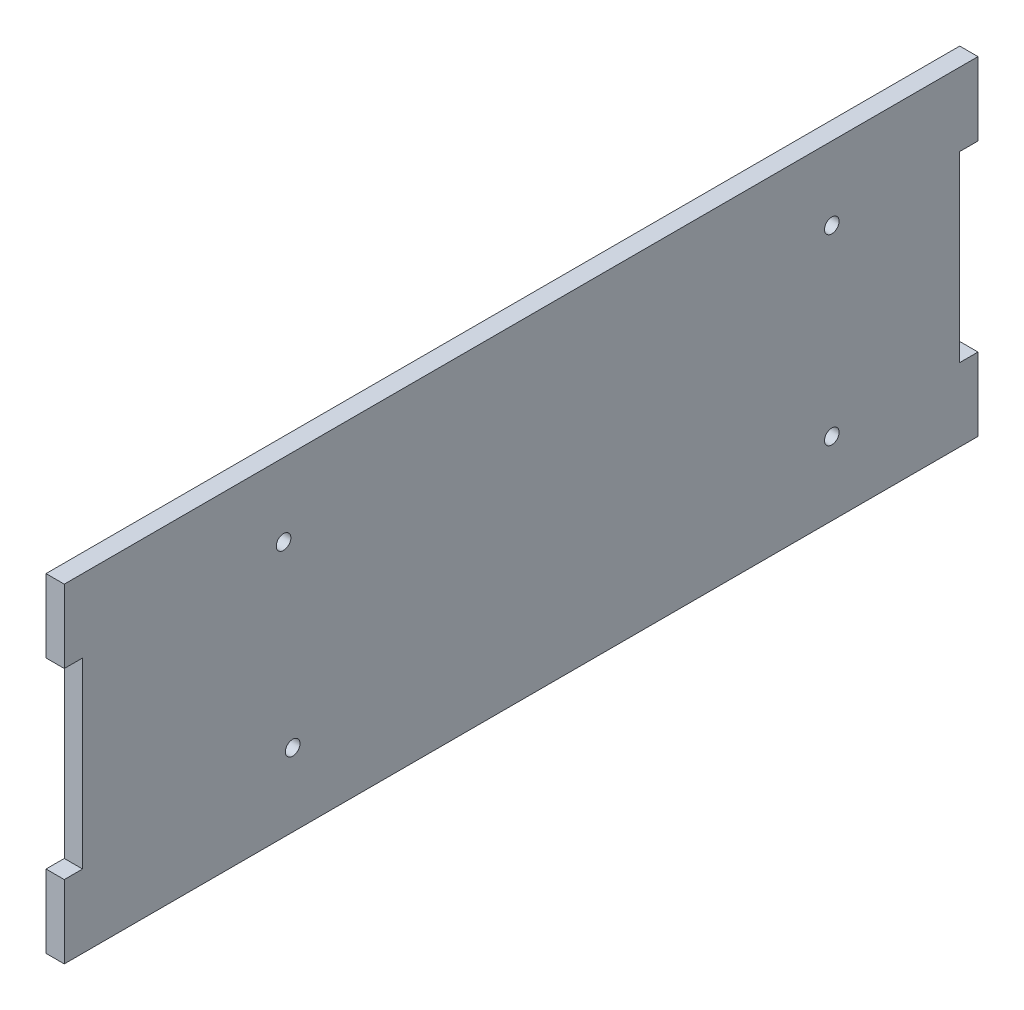
ISO-10303-21;
HEADER;
FILE_DESCRIPTION(('STEP AP214'),'2;1');
FILE_NAME('part.step','',(''),(''),'','','');
FILE_SCHEMA(('AUTOMOTIVE_DESIGN { 1 0 10303 214 1 1 1 1 }'));
ENDSEC;
DATA;
#1=APPLICATION_CONTEXT('core data for automotive mechanical design processes');
#2=APPLICATION_PROTOCOL_DEFINITION('international standard','automotive_design',2000,#1);
#3=PRODUCT_CONTEXT('',#1,'mechanical');
#4=PRODUCT('Part','Part','',(#3));
#5=PRODUCT_RELATED_PRODUCT_CATEGORY('part','',(#4));
#6=PRODUCT_DEFINITION_FORMATION('','',#4);
#7=PRODUCT_DEFINITION_CONTEXT('part definition',#1,'design');
#8=PRODUCT_DEFINITION('design','',#6,#7);
#9=PRODUCT_DEFINITION_SHAPE('','',#8);
#10=(LENGTH_UNIT() NAMED_UNIT(*) SI_UNIT(.MILLI.,.METRE.));
#11=(NAMED_UNIT(*) PLANE_ANGLE_UNIT() SI_UNIT($,.RADIAN.));
#12=(NAMED_UNIT(*) SI_UNIT($,.STERADIAN.) SOLID_ANGLE_UNIT());
#13=UNCERTAINTY_MEASURE_WITH_UNIT(LENGTH_MEASURE(1.E-05),#10,'distance_accuracy_value','');
#14=(GEOMETRIC_REPRESENTATION_CONTEXT(3) GLOBAL_UNCERTAINTY_ASSIGNED_CONTEXT((#13)) GLOBAL_UNIT_ASSIGNED_CONTEXT((#10,
#11,#12)) REPRESENTATION_CONTEXT('',''));
#15=CARTESIAN_POINT('',(0.,0.,0.));
#16=DIRECTION('',(0.,0.,1.));
#17=DIRECTION('',(1.,0.,0.));
#18=AXIS2_PLACEMENT_3D('',#15,#16,#17);
#19=CARTESIAN_POINT('',(5.,0.,0.));
#20=DIRECTION('',(1.,0.,0.));
#21=DIRECTION('',(0.,0.,-1.));
#22=AXIS2_PLACEMENT_3D('',#19,#20,#21);
#23=PLANE('',#22);
#24=CARTESIAN_POINT('',(5.,20.,187.5));
#25=DIRECTION('',(1.,0.,0.));
#26=DIRECTION('',(0.,0.,-1.));
#27=AXIS2_PLACEMENT_3D('',#24,#25,#26);
#28=CIRCLE('',#27,2.00000000000002);
#29=CARTESIAN_POINT('',(5.,20.,185.5));
#30=VERTEX_POINT('',#29);
#31=EDGE_CURVE('E293',#30,#30,#28,.T.);
#32=ORIENTED_EDGE('',*,*,#31,.F.);
#33=EDGE_LOOP('',(#32));
#34=FACE_BOUND('',#33,.T.);
#35=CARTESIAN_POINT('',(5.,70.,40.));
#36=DIRECTION('',(1.,0.,0.));
#37=DIRECTION('',(0.,0.,-1.));
#38=AXIS2_PLACEMENT_3D('',#35,#36,#37);
#39=CIRCLE('',#38,2.);
#40=CARTESIAN_POINT('',(5.,70.,38.));
#41=VERTEX_POINT('',#40);
#42=EDGE_CURVE('E160',#41,#41,#39,.T.);
#43=ORIENTED_EDGE('',*,*,#42,.F.);
#44=EDGE_LOOP('',(#43));
#45=FACE_BOUND('',#44,.T.);
#46=DIRECTION('',(0.,1.,0.));
#47=VECTOR('',#46,1.);
#48=CARTESIAN_POINT('',(5.,0.,0.));
#49=LINE('',#48,#47);
#50=CARTESIAN_POINT('',(5.,0.,0.));
#51=VERTEX_POINT('',#50);
#52=CARTESIAN_POINT('',(5.,20.,0.));
#53=VERTEX_POINT('',#52);
#54=EDGE_CURVE('E179',#51,#53,#49,.T.);
#55=ORIENTED_EDGE('',*,*,#54,.T.);
#56=DIRECTION('',(0.,0.,1.));
#57=VECTOR('',#56,1.);
#58=CARTESIAN_POINT('',(5.,20.,0.));
#59=LINE('',#58,#57);
#60=CARTESIAN_POINT('',(5.,20.,5.));
#61=VERTEX_POINT('',#60);
#62=EDGE_CURVE('E107',#53,#61,#59,.T.);
#63=ORIENTED_EDGE('',*,*,#62,.T.);
#64=DIRECTION('',(0.,1.,0.));
#65=VECTOR('',#64,1.);
#66=CARTESIAN_POINT('',(5.,70.,5.00000000000006));
#67=LINE('',#66,#65);
#68=CARTESIAN_POINT('',(5.,70.,5.00000000000006));
#69=VERTEX_POINT('',#68);
#70=EDGE_CURVE('E206',#61,#69,#67,.T.);
#71=ORIENTED_EDGE('',*,*,#70,.T.);
#72=DIRECTION('',(0.,0.,-1.));
#73=VECTOR('',#72,1.);
#74=CARTESIAN_POINT('',(5.,70.,0.));
#75=LINE('',#74,#73);
#76=CARTESIAN_POINT('',(5.,70.,0.));
#77=VERTEX_POINT('',#76);
#78=EDGE_CURVE('E225',#69,#77,#75,.T.);
#79=ORIENTED_EDGE('',*,*,#78,.T.);
#80=DIRECTION('',(0.,1.,0.));
#81=VECTOR('',#80,1.);
#82=CARTESIAN_POINT('',(5.,70.,0.));
#83=LINE('',#82,#81);
#84=CARTESIAN_POINT('',(5.,90.,0.));
#85=VERTEX_POINT('',#84);
#86=EDGE_CURVE('E222',#77,#85,#83,.T.);
#87=ORIENTED_EDGE('',*,*,#86,.T.);
#88=DIRECTION('',(0.,0.,1.));
#89=VECTOR('',#88,1.);
#90=CARTESIAN_POINT('',(5.,90.,0.));
#91=LINE('',#90,#89);
#92=CARTESIAN_POINT('',(5.,90.,250.));
#93=VERTEX_POINT('',#92);
#94=EDGE_CURVE('E224',#85,#93,#91,.T.);
#95=ORIENTED_EDGE('',*,*,#94,.T.);
#96=DIRECTION('',(0.,-1.,0.));
#97=VECTOR('',#96,1.);
#98=CARTESIAN_POINT('',(5.,70.,250.));
#99=LINE('',#98,#97);
#100=CARTESIAN_POINT('',(5.,70.,250.));
#101=VERTEX_POINT('',#100);
#102=EDGE_CURVE('E227',#93,#101,#99,.T.);
#103=ORIENTED_EDGE('',*,*,#102,.T.);
#104=DIRECTION('',(0.,0.,-1.));
#105=VECTOR('',#104,1.);
#106=CARTESIAN_POINT('',(5.,70.,250.));
#107=LINE('',#106,#105);
#108=CARTESIAN_POINT('',(5.,70.,245.));
#109=VERTEX_POINT('',#108);
#110=EDGE_CURVE('E233',#101,#109,#107,.T.);
#111=ORIENTED_EDGE('',*,*,#110,.T.);
#112=DIRECTION('',(0.,-1.,0.));
#113=VECTOR('',#112,1.);
#114=CARTESIAN_POINT('',(5.,70.,245.));
#115=LINE('',#114,#113);
#116=CARTESIAN_POINT('',(5.,20.,245.));
#117=VERTEX_POINT('',#116);
#118=EDGE_CURVE('E138',#109,#117,#115,.T.);
#119=ORIENTED_EDGE('',*,*,#118,.T.);
#120=DIRECTION('',(0.,0.,1.));
#121=VECTOR('',#120,1.);
#122=CARTESIAN_POINT('',(5.,20.,250.));
#123=LINE('',#122,#121);
#124=CARTESIAN_POINT('',(5.,20.,250.));
#125=VERTEX_POINT('',#124);
#126=EDGE_CURVE('E132',#117,#125,#123,.T.);
#127=ORIENTED_EDGE('',*,*,#126,.T.);
#128=DIRECTION('',(0.,-1.,0.));
#129=VECTOR('',#128,1.);
#130=CARTESIAN_POINT('',(5.,0.,250.));
#131=LINE('',#130,#129);
#132=CARTESIAN_POINT('',(5.,0.,250.));
#133=VERTEX_POINT('',#132);
#134=EDGE_CURVE('E136',#125,#133,#131,.T.);
#135=ORIENTED_EDGE('',*,*,#134,.T.);
#136=DIRECTION('',(0.,0.,-1.));
#137=VECTOR('',#136,1.);
#138=CARTESIAN_POINT('',(5.,0.,0.));
#139=LINE('',#138,#137);
#140=EDGE_CURVE('E52',#133,#51,#139,.T.);
#141=ORIENTED_EDGE('',*,*,#140,.T.);
#142=EDGE_LOOP('',(#55,#63,#71,#79,#87,#95,#103,#111,#119,#127,#135,#141));
#143=FACE_BOUND('',#142,.T.);
#144=CARTESIAN_POINT('',(5.,20.,40.));
#145=DIRECTION('',(1.,0.,0.));
#146=DIRECTION('',(0.,0.,-1.));
#147=AXIS2_PLACEMENT_3D('',#144,#145,#146);
#148=CIRCLE('',#147,2.);
#149=CARTESIAN_POINT('',(5.,20.,38.));
#150=VERTEX_POINT('',#149);
#151=EDGE_CURVE('E299',#150,#150,#148,.T.);
#152=ORIENTED_EDGE('',*,*,#151,.F.);
#153=EDGE_LOOP('',(#152));
#154=FACE_BOUND('',#153,.T.);
#155=CARTESIAN_POINT('',(5.,70.,190.));
#156=DIRECTION('',(1.,0.,0.));
#157=DIRECTION('',(0.,0.,-1.));
#158=AXIS2_PLACEMENT_3D('',#155,#156,#157);
#159=CIRCLE('',#158,2.);
#160=CARTESIAN_POINT('',(5.,70.,188.));
#161=VERTEX_POINT('',#160);
#162=EDGE_CURVE('E284',#161,#161,#159,.T.);
#163=ORIENTED_EDGE('',*,*,#162,.F.);
#164=EDGE_LOOP('',(#163));
#165=FACE_BOUND('',#164,.T.);
#166=ADVANCED_FACE('F35',(#34,#45,#143,#154,#165),#23,.T.);
#167=CARTESIAN_POINT('',(0.,0.,0.));
#168=DIRECTION('',(1.,0.,0.));
#169=DIRECTION('',(0.,0.,-1.));
#170=AXIS2_PLACEMENT_3D('',#167,#168,#169);
#171=PLANE('',#170);
#172=DIRECTION('',(0.,1.,0.));
#173=VECTOR('',#172,1.);
#174=CARTESIAN_POINT('',(0.,0.,0.));
#175=LINE('',#174,#173);
#176=CARTESIAN_POINT('',(0.,0.,0.));
#177=VERTEX_POINT('',#176);
#178=CARTESIAN_POINT('',(0.,20.,0.));
#179=VERTEX_POINT('',#178);
#180=EDGE_CURVE('E156',#177,#179,#175,.T.);
#181=ORIENTED_EDGE('',*,*,#180,.F.);
#182=DIRECTION('',(0.,0.,-1.));
#183=VECTOR('',#182,1.);
#184=CARTESIAN_POINT('',(0.,0.,0.));
#185=LINE('',#184,#183);
#186=CARTESIAN_POINT('',(0.,0.,250.));
#187=VERTEX_POINT('',#186);
#188=EDGE_CURVE('E99',#187,#177,#185,.T.);
#189=ORIENTED_EDGE('',*,*,#188,.F.);
#190=DIRECTION('',(0.,-1.,0.));
#191=VECTOR('',#190,1.);
#192=CARTESIAN_POINT('',(0.,0.,250.));
#193=LINE('',#192,#191);
#194=CARTESIAN_POINT('',(0.,20.,250.));
#195=VERTEX_POINT('',#194);
#196=EDGE_CURVE('E93',#195,#187,#193,.T.);
#197=ORIENTED_EDGE('',*,*,#196,.F.);
#198=DIRECTION('',(0.,0.,1.));
#199=VECTOR('',#198,1.);
#200=CARTESIAN_POINT('',(0.,20.,250.));
#201=LINE('',#200,#199);
#202=CARTESIAN_POINT('',(0.,20.,245.));
#203=VERTEX_POINT('',#202);
#204=EDGE_CURVE('E146',#203,#195,#201,.T.);
#205=ORIENTED_EDGE('',*,*,#204,.F.);
#206=DIRECTION('',(0.,-1.,0.));
#207=VECTOR('',#206,1.);
#208=CARTESIAN_POINT('',(0.,70.,245.));
#209=LINE('',#208,#207);
#210=CARTESIAN_POINT('',(0.,70.,245.));
#211=VERTEX_POINT('',#210);
#212=EDGE_CURVE('E174',#211,#203,#209,.T.);
#213=ORIENTED_EDGE('',*,*,#212,.F.);
#214=DIRECTION('',(0.,0.,-1.));
#215=VECTOR('',#214,1.);
#216=CARTESIAN_POINT('',(0.,70.,250.));
#217=LINE('',#216,#215);
#218=CARTESIAN_POINT('',(0.,70.,250.));
#219=VERTEX_POINT('',#218);
#220=EDGE_CURVE('E172',#219,#211,#217,.T.);
#221=ORIENTED_EDGE('',*,*,#220,.F.);
#222=DIRECTION('',(0.,-1.,0.));
#223=VECTOR('',#222,1.);
#224=CARTESIAN_POINT('',(0.,70.,250.));
#225=LINE('',#224,#223);
#226=CARTESIAN_POINT('',(0.,90.,250.));
#227=VERTEX_POINT('',#226);
#228=EDGE_CURVE('E170',#227,#219,#225,.T.);
#229=ORIENTED_EDGE('',*,*,#228,.F.);
#230=DIRECTION('',(0.,0.,1.));
#231=VECTOR('',#230,1.);
#232=CARTESIAN_POINT('',(0.,90.,0.));
#233=LINE('',#232,#231);
#234=CARTESIAN_POINT('',(0.,90.,0.));
#235=VERTEX_POINT('',#234);
#236=EDGE_CURVE('E168',#235,#227,#233,.T.);
#237=ORIENTED_EDGE('',*,*,#236,.F.);
#238=DIRECTION('',(0.,1.,0.));
#239=VECTOR('',#238,1.);
#240=CARTESIAN_POINT('',(0.,70.,0.));
#241=LINE('',#240,#239);
#242=CARTESIAN_POINT('',(0.,70.,0.));
#243=VERTEX_POINT('',#242);
#244=EDGE_CURVE('E166',#243,#235,#241,.T.);
#245=ORIENTED_EDGE('',*,*,#244,.F.);
#246=DIRECTION('',(0.,0.,-1.));
#247=VECTOR('',#246,1.);
#248=CARTESIAN_POINT('',(0.,70.,0.));
#249=LINE('',#248,#247);
#250=CARTESIAN_POINT('',(0.,70.,5.00000000000006));
#251=VERTEX_POINT('',#250);
#252=EDGE_CURVE('E164',#251,#243,#249,.T.);
#253=ORIENTED_EDGE('',*,*,#252,.F.);
#254=DIRECTION('',(0.,1.,0.));
#255=VECTOR('',#254,1.);
#256=CARTESIAN_POINT('',(0.,70.,5.00000000000006));
#257=LINE('',#256,#255);
#258=CARTESIAN_POINT('',(0.,20.,5.));
#259=VERTEX_POINT('',#258);
#260=EDGE_CURVE('E162',#259,#251,#257,.T.);
#261=ORIENTED_EDGE('',*,*,#260,.F.);
#262=DIRECTION('',(0.,0.,1.));
#263=VECTOR('',#262,1.);
#264=CARTESIAN_POINT('',(0.,20.,0.));
#265=LINE('',#264,#263);
#266=EDGE_CURVE('E159',#179,#259,#265,.T.);
#267=ORIENTED_EDGE('',*,*,#266,.F.);
#268=EDGE_LOOP('',(#181,#189,#197,#205,#213,#221,#229,#237,#245,#253,#261,#267));
#269=FACE_BOUND('',#268,.T.);
#270=CARTESIAN_POINT('',(0.,70.,40.));
#271=DIRECTION('',(1.,0.,0.));
#272=DIRECTION('',(0.,0.,-1.));
#273=AXIS2_PLACEMENT_3D('',#270,#271,#272);
#274=CIRCLE('',#273,2.);
#275=CARTESIAN_POINT('',(0.,70.,38.));
#276=VERTEX_POINT('',#275);
#277=EDGE_CURVE('E302',#276,#276,#274,.T.);
#278=ORIENTED_EDGE('',*,*,#277,.T.);
#279=EDGE_LOOP('',(#278));
#280=FACE_BOUND('',#279,.T.);
#281=CARTESIAN_POINT('',(0.,20.,40.));
#282=DIRECTION('',(1.,0.,0.));
#283=DIRECTION('',(0.,0.,-1.));
#284=AXIS2_PLACEMENT_3D('',#281,#282,#283);
#285=CIRCLE('',#284,2.);
#286=CARTESIAN_POINT('',(0.,20.,38.));
#287=VERTEX_POINT('',#286);
#288=EDGE_CURVE('E296',#287,#287,#285,.T.);
#289=ORIENTED_EDGE('',*,*,#288,.T.);
#290=EDGE_LOOP('',(#289));
#291=FACE_BOUND('',#290,.T.);
#292=CARTESIAN_POINT('',(0.,20.,187.5));
#293=DIRECTION('',(1.,0.,0.));
#294=DIRECTION('',(0.,0.,-1.));
#295=AXIS2_PLACEMENT_3D('',#292,#293,#294);
#296=CIRCLE('',#295,2.00000000000002);
#297=CARTESIAN_POINT('',(0.,20.,185.5));
#298=VERTEX_POINT('',#297);
#299=EDGE_CURVE('E290',#298,#298,#296,.T.);
#300=ORIENTED_EDGE('',*,*,#299,.T.);
#301=EDGE_LOOP('',(#300));
#302=FACE_BOUND('',#301,.T.);
#303=CARTESIAN_POINT('',(0.,70.,190.));
#304=DIRECTION('',(1.,0.,0.));
#305=DIRECTION('',(0.,0.,-1.));
#306=AXIS2_PLACEMENT_3D('',#303,#304,#305);
#307=CIRCLE('',#306,2.);
#308=CARTESIAN_POINT('',(0.,70.,188.));
#309=VERTEX_POINT('',#308);
#310=EDGE_CURVE('E287',#309,#309,#307,.T.);
#311=ORIENTED_EDGE('',*,*,#310,.T.);
#312=EDGE_LOOP('',(#311));
#313=FACE_BOUND('',#312,.T.);
#314=ADVANCED_FACE('F210',(#269,#280,#291,#302,#313),#171,.F.);
#315=CARTESIAN_POINT('',(5.,0.,0.));
#316=DIRECTION('',(0.,0.,1.));
#317=DIRECTION('',(0.,-1.,0.));
#318=AXIS2_PLACEMENT_3D('',#315,#316,#317);
#319=PLANE('',#318);
#320=ORIENTED_EDGE('',*,*,#180,.T.);
#321=DIRECTION('',(-1.,0.,0.));
#322=VECTOR('',#321,1.);
#323=CARTESIAN_POINT('',(5.,20.,0.));
#324=LINE('',#323,#322);
#325=EDGE_CURVE('E11',#53,#179,#324,.T.);
#326=ORIENTED_EDGE('',*,*,#325,.F.);
#327=ORIENTED_EDGE('',*,*,#54,.F.);
#328=DIRECTION('',(-1.,0.,0.));
#329=VECTOR('',#328,1.);
#330=CARTESIAN_POINT('',(5.,0.,0.));
#331=LINE('',#330,#329);
#332=EDGE_CURVE('E152',#51,#177,#331,.T.);
#333=ORIENTED_EDGE('',*,*,#332,.T.);
#334=EDGE_LOOP('',(#320,#326,#327,#333));
#335=FACE_BOUND('',#334,.T.);
#336=ADVANCED_FACE('F37',(#335),#319,.F.);
#337=CARTESIAN_POINT('',(5.,20.,0.));
#338=DIRECTION('',(0.,-1.,0.));
#339=DIRECTION('',(0.,0.,-1.));
#340=AXIS2_PLACEMENT_3D('',#337,#338,#339);
#341=PLANE('',#340);
#342=ORIENTED_EDGE('',*,*,#266,.T.);
#343=DIRECTION('',(-1.,0.,0.));
#344=VECTOR('',#343,1.);
#345=CARTESIAN_POINT('',(5.,20.,5.));
#346=LINE('',#345,#344);
#347=EDGE_CURVE('E44',#61,#259,#346,.T.);
#348=ORIENTED_EDGE('',*,*,#347,.F.);
#349=ORIENTED_EDGE('',*,*,#62,.F.);
#350=ORIENTED_EDGE('',*,*,#325,.T.);
#351=EDGE_LOOP('',(#342,#348,#349,#350));
#352=FACE_BOUND('',#351,.T.);
#353=ADVANCED_FACE('F412',(#352),#341,.F.);
#354=CARTESIAN_POINT('',(5.,70.,5.00000000000006));
#355=DIRECTION('',(0.,0.,1.));
#356=DIRECTION('',(0.,-1.,0.));
#357=AXIS2_PLACEMENT_3D('',#354,#355,#356);
#358=PLANE('',#357);
#359=ORIENTED_EDGE('',*,*,#260,.T.);
#360=DIRECTION('',(-1.,0.,0.));
#361=VECTOR('',#360,1.);
#362=CARTESIAN_POINT('',(5.,70.,5.00000000000006));
#363=LINE('',#362,#361);
#364=EDGE_CURVE('E198',#69,#251,#363,.T.);
#365=ORIENTED_EDGE('',*,*,#364,.F.);
#366=ORIENTED_EDGE('',*,*,#70,.F.);
#367=ORIENTED_EDGE('',*,*,#347,.T.);
#368=EDGE_LOOP('',(#359,#365,#366,#367));
#369=FACE_BOUND('',#368,.T.);
#370=ADVANCED_FACE('F204',(#369),#358,.F.);
#371=CARTESIAN_POINT('',(5.,70.,0.));
#372=DIRECTION('',(0.,1.,0.));
#373=DIRECTION('',(0.,0.,1.));
#374=AXIS2_PLACEMENT_3D('',#371,#372,#373);
#375=PLANE('',#374);
#376=ORIENTED_EDGE('',*,*,#252,.T.);
#377=DIRECTION('',(-1.,0.,0.));
#378=VECTOR('',#377,1.);
#379=CARTESIAN_POINT('',(5.,70.,0.));
#380=LINE('',#379,#378);
#381=EDGE_CURVE('E195',#77,#243,#380,.T.);
#382=ORIENTED_EDGE('',*,*,#381,.F.);
#383=ORIENTED_EDGE('',*,*,#78,.F.);
#384=ORIENTED_EDGE('',*,*,#364,.T.);
#385=EDGE_LOOP('',(#376,#382,#383,#384));
#386=FACE_BOUND('',#385,.T.);
#387=ADVANCED_FACE('F216',(#386),#375,.F.);
#388=CARTESIAN_POINT('',(5.,70.,0.));
#389=DIRECTION('',(0.,0.,1.));
#390=DIRECTION('',(0.,-1.,0.));
#391=AXIS2_PLACEMENT_3D('',#388,#389,#390);
#392=PLANE('',#391);
#393=ORIENTED_EDGE('',*,*,#244,.T.);
#394=DIRECTION('',(-1.,0.,0.));
#395=VECTOR('',#394,1.);
#396=CARTESIAN_POINT('',(5.,90.,0.));
#397=LINE('',#396,#395);
#398=EDGE_CURVE('E192',#85,#235,#397,.T.);
#399=ORIENTED_EDGE('',*,*,#398,.F.);
#400=ORIENTED_EDGE('',*,*,#86,.F.);
#401=ORIENTED_EDGE('',*,*,#381,.T.);
#402=EDGE_LOOP('',(#393,#399,#400,#401));
#403=FACE_BOUND('',#402,.T.);
#404=ADVANCED_FACE('F220',(#403),#392,.F.);
#405=CARTESIAN_POINT('',(5.,90.,0.));
#406=DIRECTION('',(0.,-1.,0.));
#407=DIRECTION('',(0.,0.,-1.));
#408=AXIS2_PLACEMENT_3D('',#405,#406,#407);
#409=PLANE('',#408);
#410=ORIENTED_EDGE('',*,*,#236,.T.);
#411=DIRECTION('',(-1.,0.,0.));
#412=VECTOR('',#411,1.);
#413=CARTESIAN_POINT('',(5.,90.,250.));
#414=LINE('',#413,#412);
#415=EDGE_CURVE('E189',#93,#227,#414,.T.);
#416=ORIENTED_EDGE('',*,*,#415,.F.);
#417=ORIENTED_EDGE('',*,*,#94,.F.);
#418=ORIENTED_EDGE('',*,*,#398,.T.);
#419=EDGE_LOOP('',(#410,#416,#417,#418));
#420=FACE_BOUND('',#419,.T.);
#421=ADVANCED_FACE('F377',(#420),#409,.F.);
#422=CARTESIAN_POINT('',(5.,70.,250.));
#423=DIRECTION('',(0.,0.,-1.));
#424=DIRECTION('',(-1.,0.,0.));
#425=AXIS2_PLACEMENT_3D('',#422,#423,#424);
#426=PLANE('',#425);
#427=ORIENTED_EDGE('',*,*,#228,.T.);
#428=DIRECTION('',(-1.,0.,0.));
#429=VECTOR('',#428,1.);
#430=CARTESIAN_POINT('',(5.,70.,250.));
#431=LINE('',#430,#429);
#432=EDGE_CURVE('E186',#101,#219,#431,.T.);
#433=ORIENTED_EDGE('',*,*,#432,.F.);
#434=ORIENTED_EDGE('',*,*,#102,.F.);
#435=ORIENTED_EDGE('',*,*,#415,.T.);
#436=EDGE_LOOP('',(#427,#433,#434,#435));
#437=FACE_BOUND('',#436,.T.);
#438=ADVANCED_FACE('F368',(#437),#426,.F.);
#439=CARTESIAN_POINT('',(5.,70.,250.));
#440=DIRECTION('',(0.,1.,0.));
#441=DIRECTION('',(0.,0.,1.));
#442=AXIS2_PLACEMENT_3D('',#439,#440,#441);
#443=PLANE('',#442);
#444=ORIENTED_EDGE('',*,*,#220,.T.);
#445=DIRECTION('',(-1.,0.,0.));
#446=VECTOR('',#445,1.);
#447=CARTESIAN_POINT('',(5.,70.,245.));
#448=LINE('',#447,#446);
#449=EDGE_CURVE('E183',#109,#211,#448,.T.);
#450=ORIENTED_EDGE('',*,*,#449,.F.);
#451=ORIENTED_EDGE('',*,*,#110,.F.);
#452=ORIENTED_EDGE('',*,*,#432,.T.);
#453=EDGE_LOOP('',(#444,#450,#451,#452));
#454=FACE_BOUND('',#453,.T.);
#455=ADVANCED_FACE('F239',(#454),#443,.F.);
#456=CARTESIAN_POINT('',(5.,70.,245.));
#457=DIRECTION('',(0.,0.,-1.));
#458=DIRECTION('',(0.,1.,0.));
#459=AXIS2_PLACEMENT_3D('',#456,#457,#458);
#460=PLANE('',#459);
#461=ORIENTED_EDGE('',*,*,#212,.T.);
#462=DIRECTION('',(-1.,0.,0.));
#463=VECTOR('',#462,1.);
#464=CARTESIAN_POINT('',(5.,20.,245.));
#465=LINE('',#464,#463);
#466=EDGE_CURVE('E147',#117,#203,#465,.T.);
#467=ORIENTED_EDGE('',*,*,#466,.F.);
#468=ORIENTED_EDGE('',*,*,#118,.F.);
#469=ORIENTED_EDGE('',*,*,#449,.T.);
#470=EDGE_LOOP('',(#461,#467,#468,#469));
#471=FACE_BOUND('',#470,.T.);
#472=ADVANCED_FACE('F243',(#471),#460,.F.);
#473=CARTESIAN_POINT('',(5.,20.,250.));
#474=DIRECTION('',(0.,-1.,0.));
#475=DIRECTION('',(0.,0.,-1.));
#476=AXIS2_PLACEMENT_3D('',#473,#474,#475);
#477=PLANE('',#476);
#478=ORIENTED_EDGE('',*,*,#204,.T.);
#479=DIRECTION('',(-1.,0.,0.));
#480=VECTOR('',#479,1.);
#481=CARTESIAN_POINT('',(5.,20.,250.));
#482=LINE('',#481,#480);
#483=EDGE_CURVE('E143',#125,#195,#482,.T.);
#484=ORIENTED_EDGE('',*,*,#483,.F.);
#485=ORIENTED_EDGE('',*,*,#126,.F.);
#486=ORIENTED_EDGE('',*,*,#466,.T.);
#487=EDGE_LOOP('',(#478,#484,#485,#486));
#488=FACE_BOUND('',#487,.T.);
#489=ADVANCED_FACE('F144',(#488),#477,.F.);
#490=CARTESIAN_POINT('',(5.,0.,250.));
#491=DIRECTION('',(0.,0.,-1.));
#492=DIRECTION('',(-1.,0.,0.));
#493=AXIS2_PLACEMENT_3D('',#490,#491,#492);
#494=PLANE('',#493);
#495=ORIENTED_EDGE('',*,*,#196,.T.);
#496=DIRECTION('',(-1.,0.,0.));
#497=VECTOR('',#496,1.);
#498=CARTESIAN_POINT('',(5.,0.,250.));
#499=LINE('',#498,#497);
#500=EDGE_CURVE('E148',#133,#187,#499,.T.);
#501=ORIENTED_EDGE('',*,*,#500,.F.);
#502=ORIENTED_EDGE('',*,*,#134,.F.);
#503=ORIENTED_EDGE('',*,*,#483,.T.);
#504=EDGE_LOOP('',(#495,#501,#502,#503));
#505=FACE_BOUND('',#504,.T.);
#506=ADVANCED_FACE('F150',(#505),#494,.F.);
#507=CARTESIAN_POINT('',(5.,0.,0.));
#508=DIRECTION('',(0.,1.,0.));
#509=DIRECTION('',(0.,0.,1.));
#510=AXIS2_PLACEMENT_3D('',#507,#508,#509);
#511=PLANE('',#510);
#512=ORIENTED_EDGE('',*,*,#188,.T.);
#513=ORIENTED_EDGE('',*,*,#332,.F.);
#514=ORIENTED_EDGE('',*,*,#140,.F.);
#515=ORIENTED_EDGE('',*,*,#500,.T.);
#516=EDGE_LOOP('',(#512,#513,#514,#515));
#517=FACE_BOUND('',#516,.T.);
#518=ADVANCED_FACE('F247',(#517),#511,.F.);
#519=CARTESIAN_POINT('',(5.,70.,40.));
#520=DIRECTION('',(-1.,0.,0.));
#521=DIRECTION('',(0.,0.,1.));
#522=AXIS2_PLACEMENT_3D('',#519,#520,#521);
#523=CYLINDRICAL_SURFACE('',#522,2.);
#524=ORIENTED_EDGE('',*,*,#42,.T.);
#525=EDGE_LOOP('',(#524));
#526=FACE_BOUND('',#525,.T.);
#527=ORIENTED_EDGE('',*,*,#277,.F.);
#528=EDGE_LOOP('',(#527));
#529=FACE_BOUND('',#528,.T.);
#530=ADVANCED_FACE('F249',(#526,#529),#523,.F.);
#531=CARTESIAN_POINT('',(5.,20.,40.));
#532=DIRECTION('',(-1.,0.,0.));
#533=DIRECTION('',(0.,0.,1.));
#534=AXIS2_PLACEMENT_3D('',#531,#532,#533);
#535=CYLINDRICAL_SURFACE('',#534,2.);
#536=ORIENTED_EDGE('',*,*,#151,.T.);
#537=EDGE_LOOP('',(#536));
#538=FACE_BOUND('',#537,.T.);
#539=ORIENTED_EDGE('',*,*,#288,.F.);
#540=EDGE_LOOP('',(#539));
#541=FACE_BOUND('',#540,.T.);
#542=ADVANCED_FACE('F255',(#538,#541),#535,.F.);
#543=CARTESIAN_POINT('',(5.,20.,187.5));
#544=DIRECTION('',(-1.,0.,0.));
#545=DIRECTION('',(0.,0.,1.));
#546=AXIS2_PLACEMENT_3D('',#543,#544,#545);
#547=CYLINDRICAL_SURFACE('',#546,2.00000000000002);
#548=ORIENTED_EDGE('',*,*,#31,.T.);
#549=EDGE_LOOP('',(#548));
#550=FACE_BOUND('',#549,.T.);
#551=ORIENTED_EDGE('',*,*,#299,.F.);
#552=EDGE_LOOP('',(#551));
#553=FACE_BOUND('',#552,.T.);
#554=ADVANCED_FACE('F271',(#550,#553),#547,.F.);
#555=CARTESIAN_POINT('',(5.,70.,190.));
#556=DIRECTION('',(-1.,0.,0.));
#557=DIRECTION('',(0.,0.,1.));
#558=AXIS2_PLACEMENT_3D('',#555,#556,#557);
#559=CYLINDRICAL_SURFACE('',#558,2.);
#560=ORIENTED_EDGE('',*,*,#162,.T.);
#561=EDGE_LOOP('',(#560));
#562=FACE_BOUND('',#561,.T.);
#563=ORIENTED_EDGE('',*,*,#310,.F.);
#564=EDGE_LOOP('',(#563));
#565=FACE_BOUND('',#564,.T.);
#566=ADVANCED_FACE('F275',(#562,#565),#559,.F.);
#567=CLOSED_SHELL('',(#166,#314,#336,#353,#370,#387,#404,#421,#438,#455,#472,#489,#506,#518,
#530,#542,#554,#566));
#568=MANIFOLD_SOLID_BREP('B2',#567);
#569=ADVANCED_BREP_SHAPE_REPRESENTATION('',(#18,#568),#14);
#570=SHAPE_DEFINITION_REPRESENTATION(#9,#569);
ENDSEC;
END-ISO-10303-21;
